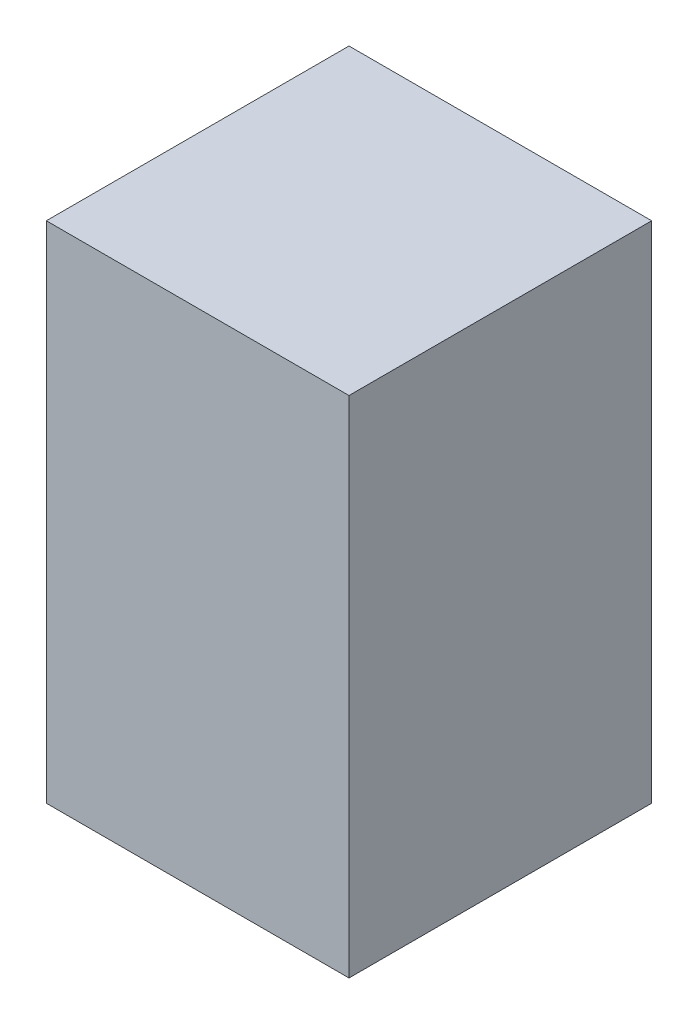
ISO-10303-21;
HEADER;
FILE_DESCRIPTION(('STEP AP214'),'2;1');
FILE_NAME('part.step','',(''),(''),'','','');
FILE_SCHEMA(('AUTOMOTIVE_DESIGN { 1 0 10303 214 1 1 1 1 }'));
ENDSEC;
DATA;
#1=APPLICATION_CONTEXT('core data for automotive mechanical design processes');
#2=APPLICATION_PROTOCOL_DEFINITION('international standard','automotive_design',2000,#1);
#3=PRODUCT_CONTEXT('',#1,'mechanical');
#4=PRODUCT('Part','Part','',(#3));
#5=PRODUCT_RELATED_PRODUCT_CATEGORY('part','',(#4));
#6=PRODUCT_DEFINITION_FORMATION('','',#4);
#7=PRODUCT_DEFINITION_CONTEXT('part definition',#1,'design');
#8=PRODUCT_DEFINITION('design','',#6,#7);
#9=PRODUCT_DEFINITION_SHAPE('','',#8);
#10=(LENGTH_UNIT() NAMED_UNIT(*) SI_UNIT(.MILLI.,.METRE.));
#11=(NAMED_UNIT(*) PLANE_ANGLE_UNIT() SI_UNIT($,.RADIAN.));
#12=(NAMED_UNIT(*) SI_UNIT($,.STERADIAN.) SOLID_ANGLE_UNIT());
#13=UNCERTAINTY_MEASURE_WITH_UNIT(LENGTH_MEASURE(1.E-05),#10,'distance_accuracy_value','');
#14=(GEOMETRIC_REPRESENTATION_CONTEXT(3) GLOBAL_UNCERTAINTY_ASSIGNED_CONTEXT((#13)) GLOBAL_UNIT_ASSIGNED_CONTEXT((#10,
#11,#12)) REPRESENTATION_CONTEXT('',''));
#15=CARTESIAN_POINT('',(0.,0.,0.));
#16=DIRECTION('',(0.,0.,1.));
#17=DIRECTION('',(1.,0.,0.));
#18=AXIS2_PLACEMENT_3D('',#15,#16,#17);
#19=CARTESIAN_POINT('',(1.5,5.,-1.5));
#20=DIRECTION('',(-1.,0.,0.));
#21=DIRECTION('',(0.,0.,1.));
#22=AXIS2_PLACEMENT_3D('',#19,#20,#21);
#23=PLANE('',#22);
#24=DIRECTION('',(0.,0.,-1.));
#25=VECTOR('',#24,1.);
#26=CARTESIAN_POINT('',(1.5,0.,-1.5));
#27=LINE('',#26,#25);
#28=CARTESIAN_POINT('',(1.5,0.,1.5));
#29=VERTEX_POINT('',#28);
#30=CARTESIAN_POINT('',(1.5,0.,-1.5));
#31=VERTEX_POINT('',#30);
#32=EDGE_CURVE('E113',#29,#31,#27,.T.);
#33=ORIENTED_EDGE('',*,*,#32,.T.);
#34=DIRECTION('',(0.,-1.,0.));
#35=VECTOR('',#34,1.);
#36=CARTESIAN_POINT('',(1.5,5.,-1.5));
#37=LINE('',#36,#35);
#38=CARTESIAN_POINT('',(1.5,5.,-1.5));
#39=VERTEX_POINT('',#38);
#40=EDGE_CURVE('E11',#39,#31,#37,.T.);
#41=ORIENTED_EDGE('',*,*,#40,.F.);
#42=DIRECTION('',(0.,0.,-1.));
#43=VECTOR('',#42,1.);
#44=CARTESIAN_POINT('',(1.5,5.,-1.5));
#45=LINE('',#44,#43);
#46=CARTESIAN_POINT('',(1.5,5.,1.5));
#47=VERTEX_POINT('',#46);
#48=EDGE_CURVE('E97',#47,#39,#45,.T.);
#49=ORIENTED_EDGE('',*,*,#48,.F.);
#50=DIRECTION('',(0.,-1.,0.));
#51=VECTOR('',#50,1.);
#52=CARTESIAN_POINT('',(1.5,5.,1.5));
#53=LINE('',#52,#51);
#54=EDGE_CURVE('E109',#47,#29,#53,.T.);
#55=ORIENTED_EDGE('',*,*,#54,.T.);
#56=EDGE_LOOP('',(#33,#41,#49,#55));
#57=FACE_BOUND('',#56,.T.);
#58=ADVANCED_FACE('F45',(#57),#23,.F.);
#59=CARTESIAN_POINT('',(-1.5,5.,-1.5));
#60=DIRECTION('',(0.,0.,1.));
#61=DIRECTION('',(1.,0.,0.));
#62=AXIS2_PLACEMENT_3D('',#59,#60,#61);
#63=PLANE('',#62);
#64=DIRECTION('',(-1.,0.,0.));
#65=VECTOR('',#64,1.);
#66=CARTESIAN_POINT('',(-1.5,0.,-1.5));
#67=LINE('',#66,#65);
#68=CARTESIAN_POINT('',(-1.5,0.,-1.5));
#69=VERTEX_POINT('',#68);
#70=EDGE_CURVE('E102',#31,#69,#67,.T.);
#71=ORIENTED_EDGE('',*,*,#70,.T.);
#72=DIRECTION('',(0.,-1.,0.));
#73=VECTOR('',#72,1.);
#74=CARTESIAN_POINT('',(-1.5,5.,-1.5));
#75=LINE('',#74,#73);
#76=CARTESIAN_POINT('',(-1.5,5.,-1.5));
#77=VERTEX_POINT('',#76);
#78=EDGE_CURVE('E54',#77,#69,#75,.T.);
#79=ORIENTED_EDGE('',*,*,#78,.F.);
#80=DIRECTION('',(-1.,0.,0.));
#81=VECTOR('',#80,1.);
#82=CARTESIAN_POINT('',(-1.5,5.,-1.5));
#83=LINE('',#82,#81);
#84=EDGE_CURVE('E92',#39,#77,#83,.T.);
#85=ORIENTED_EDGE('',*,*,#84,.F.);
#86=ORIENTED_EDGE('',*,*,#40,.T.);
#87=EDGE_LOOP('',(#71,#79,#85,#86));
#88=FACE_BOUND('',#87,.T.);
#89=ADVANCED_FACE('F101',(#88),#63,.F.);
#90=CARTESIAN_POINT('',(-1.5,5.,-1.5));
#91=DIRECTION('',(1.,0.,0.));
#92=DIRECTION('',(0.,0.,-1.));
#93=AXIS2_PLACEMENT_3D('',#90,#91,#92);
#94=PLANE('',#93);
#95=DIRECTION('',(0.,0.,1.));
#96=VECTOR('',#95,1.);
#97=CARTESIAN_POINT('',(-1.5,0.,-1.5));
#98=LINE('',#97,#96);
#99=CARTESIAN_POINT('',(-1.5,0.,1.5));
#100=VERTEX_POINT('',#99);
#101=EDGE_CURVE('E79',#69,#100,#98,.T.);
#102=ORIENTED_EDGE('',*,*,#101,.T.);
#103=DIRECTION('',(0.,-1.,0.));
#104=VECTOR('',#103,1.);
#105=CARTESIAN_POINT('',(-1.5,5.,1.5));
#106=LINE('',#105,#104);
#107=CARTESIAN_POINT('',(-1.5,5.,1.5));
#108=VERTEX_POINT('',#107);
#109=EDGE_CURVE('E104',#108,#100,#106,.T.);
#110=ORIENTED_EDGE('',*,*,#109,.F.);
#111=DIRECTION('',(0.,0.,1.));
#112=VECTOR('',#111,1.);
#113=CARTESIAN_POINT('',(-1.5,5.,-1.5));
#114=LINE('',#113,#112);
#115=EDGE_CURVE('E95',#77,#108,#114,.T.);
#116=ORIENTED_EDGE('',*,*,#115,.F.);
#117=ORIENTED_EDGE('',*,*,#78,.T.);
#118=EDGE_LOOP('',(#102,#110,#116,#117));
#119=FACE_BOUND('',#118,.T.);
#120=ADVANCED_FACE('F105',(#119),#94,.F.);
#121=CARTESIAN_POINT('',(-1.5,5.,1.5));
#122=DIRECTION('',(0.,0.,-1.));
#123=DIRECTION('',(-1.,0.,0.));
#124=AXIS2_PLACEMENT_3D('',#121,#122,#123);
#125=PLANE('',#124);
#126=DIRECTION('',(1.,0.,0.));
#127=VECTOR('',#126,1.);
#128=CARTESIAN_POINT('',(-1.5,0.,1.5));
#129=LINE('',#128,#127);
#130=EDGE_CURVE('E85',#100,#29,#129,.T.);
#131=ORIENTED_EDGE('',*,*,#130,.T.);
#132=ORIENTED_EDGE('',*,*,#54,.F.);
#133=DIRECTION('',(1.,0.,0.));
#134=VECTOR('',#133,1.);
#135=CARTESIAN_POINT('',(-1.5,5.,1.5));
#136=LINE('',#135,#134);
#137=EDGE_CURVE('E62',#108,#47,#136,.T.);
#138=ORIENTED_EDGE('',*,*,#137,.F.);
#139=ORIENTED_EDGE('',*,*,#109,.T.);
#140=EDGE_LOOP('',(#131,#132,#138,#139));
#141=FACE_BOUND('',#140,.T.);
#142=ADVANCED_FACE('F126',(#141),#125,.F.);
#143=CARTESIAN_POINT('',(0.,5.,0.));
#144=DIRECTION('',(0.,1.,0.));
#145=DIRECTION('',(0.,0.,1.));
#146=AXIS2_PLACEMENT_3D('',#143,#144,#145);
#147=PLANE('',#146);
#148=ORIENTED_EDGE('',*,*,#48,.T.);
#149=ORIENTED_EDGE('',*,*,#84,.T.);
#150=ORIENTED_EDGE('',*,*,#115,.T.);
#151=ORIENTED_EDGE('',*,*,#137,.T.);
#152=EDGE_LOOP('',(#148,#149,#150,#151));
#153=FACE_BOUND('',#152,.T.);
#154=ADVANCED_FACE('F93',(#153),#147,.T.);
#155=CARTESIAN_POINT('',(0.,0.,0.));
#156=DIRECTION('',(0.,1.,0.));
#157=DIRECTION('',(0.,0.,1.));
#158=AXIS2_PLACEMENT_3D('',#155,#156,#157);
#159=PLANE('',#158);
#160=ORIENTED_EDGE('',*,*,#32,.F.);
#161=ORIENTED_EDGE('',*,*,#130,.F.);
#162=ORIENTED_EDGE('',*,*,#101,.F.);
#163=ORIENTED_EDGE('',*,*,#70,.F.);
#164=EDGE_LOOP('',(#160,#161,#162,#163));
#165=FACE_BOUND('',#164,.T.);
#166=ADVANCED_FACE('F129',(#165),#159,.F.);
#167=CLOSED_SHELL('',(#58,#89,#120,#142,#154,#166));
#168=MANIFOLD_SOLID_BREP('B2',#167);
#169=ADVANCED_BREP_SHAPE_REPRESENTATION('',(#18,#168),#14);
#170=SHAPE_DEFINITION_REPRESENTATION(#9,#169);
ENDSEC;
END-ISO-10303-21;
